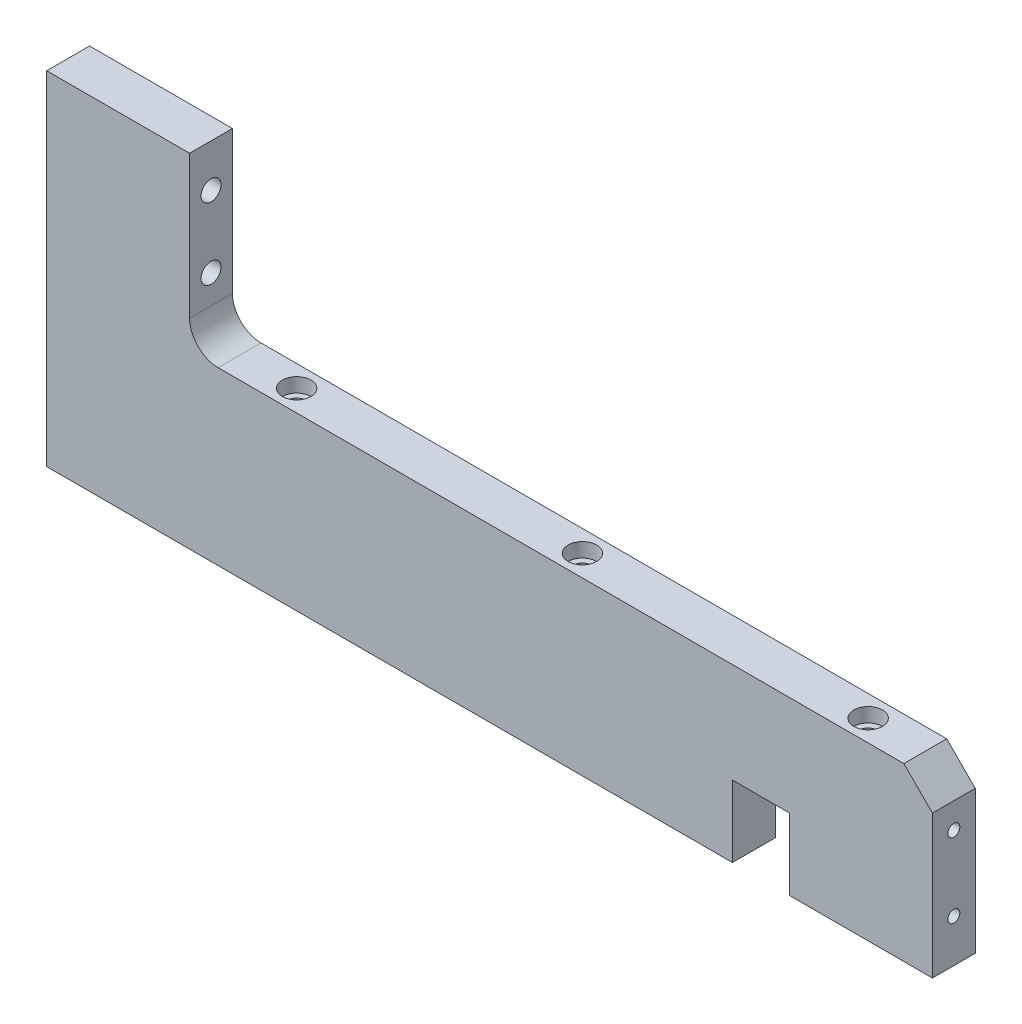
ISO-10303-21;
HEADER;
FILE_DESCRIPTION(('STEP AP214'),'2;1');
FILE_NAME('part.step','',(''),(''),'','','');
FILE_SCHEMA(('AUTOMOTIVE_DESIGN { 1 0 10303 214 1 1 1 1 }'));
ENDSEC;
DATA;
#1=APPLICATION_CONTEXT('core data for automotive mechanical design processes');
#2=APPLICATION_PROTOCOL_DEFINITION('international standard','automotive_design',2000,#1);
#3=PRODUCT_CONTEXT('',#1,'mechanical');
#4=PRODUCT('Part','Part','',(#3));
#5=PRODUCT_RELATED_PRODUCT_CATEGORY('part','',(#4));
#6=PRODUCT_DEFINITION_FORMATION('','',#4);
#7=PRODUCT_DEFINITION_CONTEXT('part definition',#1,'design');
#8=PRODUCT_DEFINITION('design','',#6,#7);
#9=PRODUCT_DEFINITION_SHAPE('','',#8);
#10=(LENGTH_UNIT() NAMED_UNIT(*) SI_UNIT(.MILLI.,.METRE.));
#11=(NAMED_UNIT(*) PLANE_ANGLE_UNIT() SI_UNIT($,.RADIAN.));
#12=(NAMED_UNIT(*) SI_UNIT($,.STERADIAN.) SOLID_ANGLE_UNIT());
#13=UNCERTAINTY_MEASURE_WITH_UNIT(LENGTH_MEASURE(1.E-05),#10,'distance_accuracy_value','');
#14=(GEOMETRIC_REPRESENTATION_CONTEXT(3) GLOBAL_UNCERTAINTY_ASSIGNED_CONTEXT((#13)) GLOBAL_UNIT_ASSIGNED_CONTEXT((#10,
#11,#12)) REPRESENTATION_CONTEXT('',''));
#15=CARTESIAN_POINT('',(0.,0.,0.));
#16=DIRECTION('',(0.,0.,1.));
#17=DIRECTION('',(1.,0.,0.));
#18=AXIS2_PLACEMENT_3D('',#15,#16,#17);
#19=CARTESIAN_POINT('',(0.,0.,15.));
#20=DIRECTION('',(0.,1.,0.));
#21=DIRECTION('',(0.,0.,1.));
#22=AXIS2_PLACEMENT_3D('',#19,#20,#21);
#23=PLANE('',#22);
#24=CARTESIAN_POINT('',(280.,0.,7.50000000000003));
#25=DIRECTION('',(0.,1.,0.));
#26=DIRECTION('',(0.,0.,1.));
#27=AXIS2_PLACEMENT_3D('',#24,#25,#26);
#28=CIRCLE('',#27,2.90000000000001);
#29=CARTESIAN_POINT('',(280.,0.,10.4));
#30=VERTEX_POINT('',#29);
#31=EDGE_CURVE('E212',#30,#30,#28,.T.);
#32=ORIENTED_EDGE('',*,*,#31,.T.);
#33=EDGE_LOOP('',(#32));
#34=FACE_BOUND('',#33,.T.);
#35=DIRECTION('',(1.,0.,0.));
#36=VECTOR('',#35,1.);
#37=CARTESIAN_POINT('',(0.,0.,15.));
#38=LINE('',#37,#36);
#39=CARTESIAN_POINT('',(260.,0.,15.));
#40=VERTEX_POINT('',#39);
#41=CARTESIAN_POINT('',(310.,0.,15.));
#42=VERTEX_POINT('',#41);
#43=EDGE_CURVE('E241',#40,#42,#38,.T.);
#44=ORIENTED_EDGE('',*,*,#43,.F.);
#45=DIRECTION('',(0.,0.,1.));
#46=VECTOR('',#45,1.);
#47=CARTESIAN_POINT('',(260.,0.,0.));
#48=LINE('',#47,#46);
#49=CARTESIAN_POINT('',(260.,0.,0.));
#50=VERTEX_POINT('',#49);
#51=EDGE_CURVE('E161',#50,#40,#48,.T.);
#52=ORIENTED_EDGE('',*,*,#51,.F.);
#53=DIRECTION('',(1.,0.,0.));
#54=VECTOR('',#53,1.);
#55=CARTESIAN_POINT('',(0.,0.,0.));
#56=LINE('',#55,#54);
#57=CARTESIAN_POINT('',(310.,0.,0.));
#58=VERTEX_POINT('',#57);
#59=EDGE_CURVE('E152',#50,#58,#56,.T.);
#60=ORIENTED_EDGE('',*,*,#59,.T.);
#61=DIRECTION('',(0.,0.,-1.));
#62=VECTOR('',#61,1.);
#63=CARTESIAN_POINT('',(310.,0.,15.));
#64=LINE('',#63,#62);
#65=EDGE_CURVE('E263',#42,#58,#64,.T.);
#66=ORIENTED_EDGE('',*,*,#65,.F.);
#67=EDGE_LOOP('',(#44,#52,#60,#66));
#68=FACE_BOUND('',#67,.T.);
#69=ADVANCED_FACE('F37',(#34,#68),#23,.F.);
#70=CARTESIAN_POINT('',(0.,0.,15.));
#71=DIRECTION('',(1.,0.,0.));
#72=DIRECTION('',(0.,0.,-1.));
#73=AXIS2_PLACEMENT_3D('',#70,#71,#72);
#74=PLANE('',#73);
#75=CARTESIAN_POINT('',(0.,105.,7.50000000000001));
#76=DIRECTION('',(1.,0.,0.));
#77=DIRECTION('',(0.,0.,-1.));
#78=AXIS2_PLACEMENT_3D('',#75,#76,#77);
#79=CIRCLE('',#78,3.5);
#80=CARTESIAN_POINT('',(0.,105.,4.));
#81=VERTEX_POINT('',#80);
#82=EDGE_CURVE('E180',#81,#81,#79,.T.);
#83=ORIENTED_EDGE('',*,*,#82,.T.);
#84=EDGE_LOOP('',(#83));
#85=FACE_BOUND('',#84,.T.);
#86=CARTESIAN_POINT('',(0.,80.,7.5));
#87=DIRECTION('',(1.,0.,0.));
#88=DIRECTION('',(0.,0.,-1.));
#89=AXIS2_PLACEMENT_3D('',#86,#87,#88);
#90=CIRCLE('',#89,3.5);
#91=CARTESIAN_POINT('',(0.,80.,4.));
#92=VERTEX_POINT('',#91);
#93=EDGE_CURVE('E186',#92,#92,#90,.T.);
#94=ORIENTED_EDGE('',*,*,#93,.T.);
#95=EDGE_LOOP('',(#94));
#96=FACE_BOUND('',#95,.T.);
#97=DIRECTION('',(0.,-1.,0.));
#98=VECTOR('',#97,1.);
#99=CARTESIAN_POINT('',(0.,0.,0.));
#100=LINE('',#99,#98);
#101=CARTESIAN_POINT('',(0.,120.,0.));
#102=VERTEX_POINT('',#101);
#103=CARTESIAN_POINT('',(0.,0.,0.));
#104=VERTEX_POINT('',#103);
#105=EDGE_CURVE('E237',#102,#104,#100,.T.);
#106=ORIENTED_EDGE('',*,*,#105,.T.);
#107=DIRECTION('',(0.,0.,-1.));
#108=VECTOR('',#107,1.);
#109=CARTESIAN_POINT('',(0.,0.,15.));
#110=LINE('',#109,#108);
#111=CARTESIAN_POINT('',(0.,0.,15.));
#112=VERTEX_POINT('',#111);
#113=EDGE_CURVE('E266',#112,#104,#110,.T.);
#114=ORIENTED_EDGE('',*,*,#113,.F.);
#115=DIRECTION('',(0.,-1.,0.));
#116=VECTOR('',#115,1.);
#117=CARTESIAN_POINT('',(0.,0.,15.));
#118=LINE('',#117,#116);
#119=CARTESIAN_POINT('',(0.,120.,15.));
#120=VERTEX_POINT('',#119);
#121=EDGE_CURVE('E238',#120,#112,#118,.T.);
#122=ORIENTED_EDGE('',*,*,#121,.F.);
#123=DIRECTION('',(0.,0.,-1.));
#124=VECTOR('',#123,1.);
#125=CARTESIAN_POINT('',(0.,120.,15.));
#126=LINE('',#125,#124);
#127=EDGE_CURVE('E251',#120,#102,#126,.T.);
#128=ORIENTED_EDGE('',*,*,#127,.T.);
#129=EDGE_LOOP('',(#106,#114,#122,#128));
#130=FACE_BOUND('',#129,.T.);
#131=ADVANCED_FACE('F315',(#85,#96,#130),#74,.F.);
#132=CARTESIAN_POINT('',(80.,0.,7.50000000000003));
#133=DIRECTION('',(0.,1.,0.));
#134=DIRECTION('',(0.,0.,1.));
#135=AXIS2_PLACEMENT_3D('',#132,#133,#134);
#136=CIRCLE('',#135,2.89999999999999);
#137=CARTESIAN_POINT('',(80.,0.,10.4));
#138=VERTEX_POINT('',#137);
#139=EDGE_CURVE('E200',#138,#138,#136,.T.);
#140=ORIENTED_EDGE('',*,*,#139,.T.);
#141=EDGE_LOOP('',(#140));
#142=FACE_BOUND('',#141,.T.);
#143=CARTESIAN_POINT('',(180.,0.,7.50000000000002));
#144=DIRECTION('',(0.,1.,0.));
#145=DIRECTION('',(0.,0.,1.));
#146=AXIS2_PLACEMENT_3D('',#143,#144,#145);
#147=CIRCLE('',#146,2.89999999999999);
#148=CARTESIAN_POINT('',(180.,0.,10.4));
#149=VERTEX_POINT('',#148);
#150=EDGE_CURVE('E224',#149,#149,#147,.T.);
#151=ORIENTED_EDGE('',*,*,#150,.T.);
#152=EDGE_LOOP('',(#151));
#153=FACE_BOUND('',#152,.T.);
#154=CARTESIAN_POINT('',(240.,0.,0.));
#155=VERTEX_POINT('',#154);
#156=EDGE_CURVE('E254',#104,#155,#56,.T.);
#157=ORIENTED_EDGE('',*,*,#156,.T.);
#158=DIRECTION('',(0.,0.,1.));
#159=VECTOR('',#158,1.);
#160=CARTESIAN_POINT('',(240.,0.,0.));
#161=LINE('',#160,#159);
#162=CARTESIAN_POINT('',(240.,0.,15.));
#163=VERTEX_POINT('',#162);
#164=EDGE_CURVE('E164',#155,#163,#161,.T.);
#165=ORIENTED_EDGE('',*,*,#164,.T.);
#166=EDGE_CURVE('E243',#112,#163,#38,.T.);
#167=ORIENTED_EDGE('',*,*,#166,.F.);
#168=ORIENTED_EDGE('',*,*,#113,.T.);
#169=EDGE_LOOP('',(#157,#165,#167,#168));
#170=FACE_BOUND('',#169,.T.);
#171=ADVANCED_FACE('F311',(#142,#153,#170),#23,.F.);
#172=CARTESIAN_POINT('',(310.,0.,15.));
#173=DIRECTION('',(-1.,0.,0.));
#174=DIRECTION('',(0.,0.,1.));
#175=AXIS2_PLACEMENT_3D('',#172,#173,#174);
#176=PLANE('',#175);
#177=CARTESIAN_POINT('',(310.,41.,7.5));
#178=DIRECTION('',(1.,0.,0.));
#179=DIRECTION('',(0.,0.,-1.));
#180=AXIS2_PLACEMENT_3D('',#177,#178,#179);
#181=CIRCLE('',#180,2.1);
#182=CARTESIAN_POINT('',(310.,41.,5.4));
#183=VERTEX_POINT('',#182);
#184=EDGE_CURVE('E163',#183,#183,#181,.T.);
#185=ORIENTED_EDGE('',*,*,#184,.F.);
#186=EDGE_LOOP('',(#185));
#187=FACE_BOUND('',#186,.T.);
#188=CARTESIAN_POINT('',(310.,15.,7.5));
#189=DIRECTION('',(1.,0.,0.));
#190=DIRECTION('',(0.,0.,-1.));
#191=AXIS2_PLACEMENT_3D('',#188,#189,#190);
#192=CIRCLE('',#191,2.1);
#193=CARTESIAN_POINT('',(310.,15.,5.4));
#194=VERTEX_POINT('',#193);
#195=EDGE_CURVE('E173',#194,#194,#192,.T.);
#196=ORIENTED_EDGE('',*,*,#195,.F.);
#197=EDGE_LOOP('',(#196));
#198=FACE_BOUND('',#197,.T.);
#199=DIRECTION('',(0.,1.,0.));
#200=VECTOR('',#199,1.);
#201=CARTESIAN_POINT('',(310.,0.,0.));
#202=LINE('',#201,#200);
#203=CARTESIAN_POINT('',(310.,50.,0.));
#204=VERTEX_POINT('',#203);
#205=EDGE_CURVE('E257',#58,#204,#202,.T.);
#206=ORIENTED_EDGE('',*,*,#205,.T.);
#207=DIRECTION('',(0.,0.,1.));
#208=VECTOR('',#207,1.);
#209=CARTESIAN_POINT('',(310.,50.,15.));
#210=LINE('',#209,#208);
#211=CARTESIAN_POINT('',(310.,50.,15.));
#212=VERTEX_POINT('',#211);
#213=EDGE_CURVE('E269',#204,#212,#210,.T.);
#214=ORIENTED_EDGE('',*,*,#213,.T.);
#215=DIRECTION('',(0.,1.,0.));
#216=VECTOR('',#215,1.);
#217=CARTESIAN_POINT('',(310.,0.,15.));
#218=LINE('',#217,#216);
#219=EDGE_CURVE('E246',#42,#212,#218,.T.);
#220=ORIENTED_EDGE('',*,*,#219,.F.);
#221=ORIENTED_EDGE('',*,*,#65,.T.);
#222=EDGE_LOOP('',(#206,#214,#220,#221));
#223=FACE_BOUND('',#222,.T.);
#224=ADVANCED_FACE('F303',(#187,#198,#223),#176,.F.);
#225=CARTESIAN_POINT('',(0.,120.,15.));
#226=DIRECTION('',(0.,-1.,0.));
#227=DIRECTION('',(0.,0.,-1.));
#228=AXIS2_PLACEMENT_3D('',#225,#226,#227);
#229=PLANE('',#228);
#230=DIRECTION('',(-1.,0.,0.));
#231=VECTOR('',#230,1.);
#232=CARTESIAN_POINT('',(0.,120.,15.));
#233=LINE('',#232,#231);
#234=CARTESIAN_POINT('',(50.,120.,15.));
#235=VERTEX_POINT('',#234);
#236=EDGE_CURVE('E249',#235,#120,#233,.T.);
#237=ORIENTED_EDGE('',*,*,#236,.F.);
#238=DIRECTION('',(0.,0.,1.));
#239=VECTOR('',#238,1.);
#240=CARTESIAN_POINT('',(50.,120.,0.));
#241=LINE('',#240,#239);
#242=CARTESIAN_POINT('',(50.,120.,0.));
#243=VERTEX_POINT('',#242);
#244=EDGE_CURVE('E233',#243,#235,#241,.T.);
#245=ORIENTED_EDGE('',*,*,#244,.F.);
#246=DIRECTION('',(-1.,0.,0.));
#247=VECTOR('',#246,1.);
#248=CARTESIAN_POINT('',(0.,120.,0.));
#249=LINE('',#248,#247);
#250=EDGE_CURVE('E242',#243,#102,#249,.T.);
#251=ORIENTED_EDGE('',*,*,#250,.T.);
#252=ORIENTED_EDGE('',*,*,#127,.F.);
#253=EDGE_LOOP('',(#237,#245,#251,#252));
#254=FACE_BOUND('',#253,.T.);
#255=ADVANCED_FACE('F319',(#254),#229,.F.);
#256=CARTESIAN_POINT('',(0.,120.,15.));
#257=DIRECTION('',(0.,0.,-1.));
#258=DIRECTION('',(-1.,0.,0.));
#259=AXIS2_PLACEMENT_3D('',#256,#257,#258);
#260=PLANE('',#259);
#261=DIRECTION('',(-1.,0.,0.));
#262=VECTOR('',#261,1.);
#263=CARTESIAN_POINT('',(260.,25.,15.));
#264=LINE('',#263,#262);
#265=CARTESIAN_POINT('',(260.,25.,15.));
#266=VERTEX_POINT('',#265);
#267=CARTESIAN_POINT('',(240.,25.,15.));
#268=VERTEX_POINT('',#267);
#269=EDGE_CURVE('E155',#266,#268,#264,.T.);
#270=ORIENTED_EDGE('',*,*,#269,.F.);
#271=DIRECTION('',(0.,1.,0.));
#272=VECTOR('',#271,1.);
#273=CARTESIAN_POINT('',(260.,25.,15.));
#274=LINE('',#273,#272);
#275=EDGE_CURVE('E138',#40,#266,#274,.T.);
#276=ORIENTED_EDGE('',*,*,#275,.F.);
#277=ORIENTED_EDGE('',*,*,#43,.T.);
#278=ORIENTED_EDGE('',*,*,#219,.T.);
#279=DIRECTION('',(0.707106781186549,-0.707106781186547,0.));
#280=VECTOR('',#279,1.);
#281=CARTESIAN_POINT('',(310.,50.,15.));
#282=LINE('',#281,#280);
#283=CARTESIAN_POINT('',(300.,60.,15.));
#284=VERTEX_POINT('',#283);
#285=EDGE_CURVE('E272',#212,#284,#282,.F.);
#286=ORIENTED_EDGE('',*,*,#285,.T.);
#287=DIRECTION('',(1.,0.,0.));
#288=VECTOR('',#287,1.);
#289=CARTESIAN_POINT('',(310.,60.,15.));
#290=LINE('',#289,#288);
#291=CARTESIAN_POINT('',(60.,60.,15.));
#292=VERTEX_POINT('',#291);
#293=EDGE_CURVE('E231',#292,#284,#290,.T.);
#294=ORIENTED_EDGE('',*,*,#293,.F.);
#295=CARTESIAN_POINT('',(60.,70.,15.));
#296=DIRECTION('',(0.,0.,-1.));
#297=DIRECTION('',(-1.,0.,0.));
#298=AXIS2_PLACEMENT_3D('',#295,#296,#297);
#299=CIRCLE('',#298,10.);
#300=CARTESIAN_POINT('',(50.,70.,15.));
#301=VERTEX_POINT('',#300);
#302=EDGE_CURVE('E45',#292,#301,#299,.T.);
#303=ORIENTED_EDGE('',*,*,#302,.T.);
#304=DIRECTION('',(0.,-1.,0.));
#305=VECTOR('',#304,1.);
#306=CARTESIAN_POINT('',(50.,120.,15.));
#307=LINE('',#306,#305);
#308=EDGE_CURVE('E227',#235,#301,#307,.T.);
#309=ORIENTED_EDGE('',*,*,#308,.F.);
#310=ORIENTED_EDGE('',*,*,#236,.T.);
#311=ORIENTED_EDGE('',*,*,#121,.T.);
#312=ORIENTED_EDGE('',*,*,#166,.T.);
#313=DIRECTION('',(0.,-1.,0.));
#314=VECTOR('',#313,1.);
#315=CARTESIAN_POINT('',(240.,25.,15.));
#316=LINE('',#315,#314);
#317=EDGE_CURVE('E153',#268,#163,#316,.T.);
#318=ORIENTED_EDGE('',*,*,#317,.F.);
#319=EDGE_LOOP('',(#270,#276,#277,#278,#286,#294,#303,#309,#310,#311,#312,#318));
#320=FACE_BOUND('',#319,.T.);
#321=ADVANCED_FACE('F286',(#320),#260,.F.);
#322=CARTESIAN_POINT('',(0.,120.,0.));
#323=DIRECTION('',(0.,0.,-1.));
#324=DIRECTION('',(-1.,0.,0.));
#325=AXIS2_PLACEMENT_3D('',#322,#323,#324);
#326=PLANE('',#325);
#327=DIRECTION('',(0.,1.,0.));
#328=VECTOR('',#327,1.);
#329=CARTESIAN_POINT('',(260.,25.,0.));
#330=LINE('',#329,#328);
#331=CARTESIAN_POINT('',(260.,25.,0.));
#332=VERTEX_POINT('',#331);
#333=EDGE_CURVE('E135',#50,#332,#330,.T.);
#334=ORIENTED_EDGE('',*,*,#333,.T.);
#335=DIRECTION('',(-1.,0.,0.));
#336=VECTOR('',#335,1.);
#337=CARTESIAN_POINT('',(260.,25.,0.));
#338=LINE('',#337,#336);
#339=CARTESIAN_POINT('',(240.,25.,0.));
#340=VERTEX_POINT('',#339);
#341=EDGE_CURVE('E145',#332,#340,#338,.T.);
#342=ORIENTED_EDGE('',*,*,#341,.T.);
#343=DIRECTION('',(0.,-1.,0.));
#344=VECTOR('',#343,1.);
#345=CARTESIAN_POINT('',(240.,25.,0.));
#346=LINE('',#345,#344);
#347=EDGE_CURVE('E52',#340,#155,#346,.T.);
#348=ORIENTED_EDGE('',*,*,#347,.T.);
#349=ORIENTED_EDGE('',*,*,#156,.F.);
#350=ORIENTED_EDGE('',*,*,#105,.F.);
#351=ORIENTED_EDGE('',*,*,#250,.F.);
#352=DIRECTION('',(0.,-1.,0.));
#353=VECTOR('',#352,1.);
#354=CARTESIAN_POINT('',(50.,120.,0.));
#355=LINE('',#354,#353);
#356=CARTESIAN_POINT('',(50.,70.,0.));
#357=VERTEX_POINT('',#356);
#358=EDGE_CURVE('E228',#243,#357,#355,.T.);
#359=ORIENTED_EDGE('',*,*,#358,.T.);
#360=CARTESIAN_POINT('',(60.,70.,0.));
#361=DIRECTION('',(0.,0.,-1.));
#362=DIRECTION('',(-1.,0.,0.));
#363=AXIS2_PLACEMENT_3D('',#360,#361,#362);
#364=CIRCLE('',#363,10.);
#365=CARTESIAN_POINT('',(60.,60.,0.));
#366=VERTEX_POINT('',#365);
#367=EDGE_CURVE('E11',#357,#366,#364,.F.);
#368=ORIENTED_EDGE('',*,*,#367,.T.);
#369=DIRECTION('',(1.,0.,0.));
#370=VECTOR('',#369,1.);
#371=CARTESIAN_POINT('',(310.,60.,0.));
#372=LINE('',#371,#370);
#373=CARTESIAN_POINT('',(300.,60.,0.));
#374=VERTEX_POINT('',#373);
#375=EDGE_CURVE('E230',#366,#374,#372,.T.);
#376=ORIENTED_EDGE('',*,*,#375,.T.);
#377=DIRECTION('',(-0.707106781186549,0.707106781186547,0.));
#378=VECTOR('',#377,1.);
#379=CARTESIAN_POINT('',(120.,240.,0.));
#380=LINE('',#379,#378);
#381=EDGE_CURVE('E278',#374,#204,#380,.F.);
#382=ORIENTED_EDGE('',*,*,#381,.T.);
#383=ORIENTED_EDGE('',*,*,#205,.F.);
#384=ORIENTED_EDGE('',*,*,#59,.F.);
#385=EDGE_LOOP('',(#334,#342,#348,#349,#350,#351,#359,#368,#376,#382,#383,#384));
#386=FACE_BOUND('',#385,.T.);
#387=ADVANCED_FACE('F150',(#386),#326,.T.);
#388=CARTESIAN_POINT('',(310.,60.,0.));
#389=DIRECTION('',(0.,-1.,0.));
#390=DIRECTION('',(1.,0.,0.));
#391=AXIS2_PLACEMENT_3D('',#388,#389,#390);
#392=PLANE('',#391);
#393=CARTESIAN_POINT('',(80.,60.,7.50000000000003));
#394=DIRECTION('',(0.,1.,0.));
#395=DIRECTION('',(0.,0.,1.));
#396=AXIS2_PLACEMENT_3D('',#393,#394,#395);
#397=CIRCLE('',#396,5.);
#398=CARTESIAN_POINT('',(80.,60.,12.5));
#399=VERTEX_POINT('',#398);
#400=EDGE_CURVE('E189',#399,#399,#397,.T.);
#401=ORIENTED_EDGE('',*,*,#400,.F.);
#402=EDGE_LOOP('',(#401));
#403=FACE_BOUND('',#402,.T.);
#404=CARTESIAN_POINT('',(280.,60.,7.50000000000003));
#405=DIRECTION('',(0.,1.,0.));
#406=DIRECTION('',(0.,0.,1.));
#407=AXIS2_PLACEMENT_3D('',#404,#405,#406);
#408=CIRCLE('',#407,5.);
#409=CARTESIAN_POINT('',(280.,60.,12.5));
#410=VERTEX_POINT('',#409);
#411=EDGE_CURVE('E203',#410,#410,#408,.T.);
#412=ORIENTED_EDGE('',*,*,#411,.F.);
#413=EDGE_LOOP('',(#412));
#414=FACE_BOUND('',#413,.T.);
#415=CARTESIAN_POINT('',(180.,60.,7.50000000000002));
#416=DIRECTION('',(0.,1.,0.));
#417=DIRECTION('',(0.,0.,1.));
#418=AXIS2_PLACEMENT_3D('',#415,#416,#417);
#419=CIRCLE('',#418,5.);
#420=CARTESIAN_POINT('',(180.,60.,12.5));
#421=VERTEX_POINT('',#420);
#422=EDGE_CURVE('E215',#421,#421,#419,.T.);
#423=ORIENTED_EDGE('',*,*,#422,.F.);
#424=EDGE_LOOP('',(#423));
#425=FACE_BOUND('',#424,.T.);
#426=ORIENTED_EDGE('',*,*,#375,.F.);
#427=DIRECTION('',(0.,0.,1.));
#428=VECTOR('',#427,1.);
#429=CARTESIAN_POINT('',(60.,60.,15.));
#430=LINE('',#429,#428);
#431=EDGE_CURVE('E280',#366,#292,#430,.T.);
#432=ORIENTED_EDGE('',*,*,#431,.T.);
#433=ORIENTED_EDGE('',*,*,#293,.T.);
#434=DIRECTION('',(0.,0.,-1.));
#435=VECTOR('',#434,1.);
#436=CARTESIAN_POINT('',(300.,60.,0.));
#437=LINE('',#436,#435);
#438=EDGE_CURVE('E275',#284,#374,#437,.T.);
#439=ORIENTED_EDGE('',*,*,#438,.T.);
#440=EDGE_LOOP('',(#426,#432,#433,#439));
#441=FACE_BOUND('',#440,.T.);
#442=ADVANCED_FACE('F296',(#403,#414,#425,#441),#392,.F.);
#443=CARTESIAN_POINT('',(50.,120.,0.));
#444=DIRECTION('',(-1.,0.,0.));
#445=DIRECTION('',(0.,-1.,0.));
#446=AXIS2_PLACEMENT_3D('',#443,#444,#445);
#447=PLANE('',#446);
#448=CARTESIAN_POINT('',(50.,105.,7.50000000000001));
#449=DIRECTION('',(1.,0.,0.));
#450=DIRECTION('',(0.,0.,-1.));
#451=AXIS2_PLACEMENT_3D('',#448,#449,#450);
#452=CIRCLE('',#451,3.5);
#453=CARTESIAN_POINT('',(50.,105.,4.));
#454=VERTEX_POINT('',#453);
#455=EDGE_CURVE('E179',#454,#454,#452,.T.);
#456=ORIENTED_EDGE('',*,*,#455,.F.);
#457=EDGE_LOOP('',(#456));
#458=FACE_BOUND('',#457,.T.);
#459=CARTESIAN_POINT('',(50.,80.,7.5));
#460=DIRECTION('',(1.,0.,0.));
#461=DIRECTION('',(0.,0.,-1.));
#462=AXIS2_PLACEMENT_3D('',#459,#460,#461);
#463=CIRCLE('',#462,3.5);
#464=CARTESIAN_POINT('',(50.,80.,4.));
#465=VERTEX_POINT('',#464);
#466=EDGE_CURVE('E183',#465,#465,#463,.T.);
#467=ORIENTED_EDGE('',*,*,#466,.F.);
#468=EDGE_LOOP('',(#467));
#469=FACE_BOUND('',#468,.T.);
#470=ORIENTED_EDGE('',*,*,#308,.T.);
#471=DIRECTION('',(0.,0.,1.));
#472=VECTOR('',#471,1.);
#473=CARTESIAN_POINT('',(50.,70.,0.));
#474=LINE('',#473,#472);
#475=EDGE_CURVE('E60',#301,#357,#474,.F.);
#476=ORIENTED_EDGE('',*,*,#475,.T.);
#477=ORIENTED_EDGE('',*,*,#358,.F.);
#478=ORIENTED_EDGE('',*,*,#244,.T.);
#479=EDGE_LOOP('',(#470,#476,#477,#478));
#480=FACE_BOUND('',#479,.T.);
#481=ADVANCED_FACE('F290',(#458,#469,#480),#447,.F.);
#482=CARTESIAN_POINT('',(180.,60.,7.50000000000002));
#483=DIRECTION('',(0.,1.,0.));
#484=DIRECTION('',(0.,0.,1.));
#485=AXIS2_PLACEMENT_3D('',#482,#483,#484);
#486=CYLINDRICAL_SURFACE('',#485,2.9);
#487=ORIENTED_EDGE('',*,*,#150,.F.);
#488=EDGE_LOOP('',(#487));
#489=FACE_BOUND('',#488,.T.);
#490=CARTESIAN_POINT('',(180.,55.,7.50000000000002));
#491=DIRECTION('',(0.,1.,0.));
#492=DIRECTION('',(0.,0.,1.));
#493=AXIS2_PLACEMENT_3D('',#490,#491,#492);
#494=CIRCLE('',#493,2.90000000000001);
#495=CARTESIAN_POINT('',(180.,55.,10.4));
#496=VERTEX_POINT('',#495);
#497=EDGE_CURVE('E221',#496,#496,#494,.T.);
#498=ORIENTED_EDGE('',*,*,#497,.T.);
#499=EDGE_LOOP('',(#498));
#500=FACE_BOUND('',#499,.T.);
#501=ADVANCED_FACE('F349',(#489,#500),#486,.F.);
#502=CARTESIAN_POINT('',(182.9,55.,7.50000000000002));
#503=DIRECTION('',(0.,-1.,0.));
#504=DIRECTION('',(0.,0.,-1.));
#505=AXIS2_PLACEMENT_3D('',#502,#503,#504);
#506=PLANE('',#505);
#507=ORIENTED_EDGE('',*,*,#497,.F.);
#508=EDGE_LOOP('',(#507));
#509=FACE_BOUND('',#508,.T.);
#510=CARTESIAN_POINT('',(180.,55.,7.50000000000002));
#511=DIRECTION('',(0.,1.,0.));
#512=DIRECTION('',(0.,0.,1.));
#513=AXIS2_PLACEMENT_3D('',#510,#511,#512);
#514=CIRCLE('',#513,5.);
#515=CARTESIAN_POINT('',(180.,55.,12.5));
#516=VERTEX_POINT('',#515);
#517=EDGE_CURVE('E218',#516,#516,#514,.T.);
#518=ORIENTED_EDGE('',*,*,#517,.T.);
#519=EDGE_LOOP('',(#518));
#520=FACE_BOUND('',#519,.T.);
#521=ADVANCED_FACE('F352',(#509,#520),#506,.F.);
#522=CARTESIAN_POINT('',(180.,60.,7.50000000000002));
#523=DIRECTION('',(0.,1.,0.));
#524=DIRECTION('',(0.,0.,1.));
#525=AXIS2_PLACEMENT_3D('',#522,#523,#524);
#526=CYLINDRICAL_SURFACE('',#525,5.);
#527=ORIENTED_EDGE('',*,*,#517,.F.);
#528=EDGE_LOOP('',(#527));
#529=FACE_BOUND('',#528,.T.);
#530=ORIENTED_EDGE('',*,*,#422,.T.);
#531=EDGE_LOOP('',(#530));
#532=FACE_BOUND('',#531,.T.);
#533=ADVANCED_FACE('F358',(#529,#532),#526,.F.);
#534=CARTESIAN_POINT('',(280.,60.,7.50000000000003));
#535=DIRECTION('',(0.,1.,0.));
#536=DIRECTION('',(0.,0.,1.));
#537=AXIS2_PLACEMENT_3D('',#534,#535,#536);
#538=CYLINDRICAL_SURFACE('',#537,2.90000000000001);
#539=ORIENTED_EDGE('',*,*,#31,.F.);
#540=EDGE_LOOP('',(#539));
#541=FACE_BOUND('',#540,.T.);
#542=CARTESIAN_POINT('',(280.,55.,7.50000000000003));
#543=DIRECTION('',(0.,1.,0.));
#544=DIRECTION('',(0.,0.,1.));
#545=AXIS2_PLACEMENT_3D('',#542,#543,#544);
#546=CIRCLE('',#545,2.90000000000001);
#547=CARTESIAN_POINT('',(280.,55.,10.4));
#548=VERTEX_POINT('',#547);
#549=EDGE_CURVE('E209',#548,#548,#546,.T.);
#550=ORIENTED_EDGE('',*,*,#549,.T.);
#551=EDGE_LOOP('',(#550));
#552=FACE_BOUND('',#551,.T.);
#553=ADVANCED_FACE('F364',(#541,#552),#538,.F.);
#554=CARTESIAN_POINT('',(282.9,55.,7.50000000000003));
#555=DIRECTION('',(0.,-1.,0.));
#556=DIRECTION('',(0.,0.,-1.));
#557=AXIS2_PLACEMENT_3D('',#554,#555,#556);
#558=PLANE('',#557);
#559=ORIENTED_EDGE('',*,*,#549,.F.);
#560=EDGE_LOOP('',(#559));
#561=FACE_BOUND('',#560,.T.);
#562=CARTESIAN_POINT('',(280.,55.,7.50000000000003));
#563=DIRECTION('',(0.,1.,0.));
#564=DIRECTION('',(0.,0.,1.));
#565=AXIS2_PLACEMENT_3D('',#562,#563,#564);
#566=CIRCLE('',#565,5.);
#567=CARTESIAN_POINT('',(280.,55.,12.5));
#568=VERTEX_POINT('',#567);
#569=EDGE_CURVE('E206',#568,#568,#566,.T.);
#570=ORIENTED_EDGE('',*,*,#569,.T.);
#571=EDGE_LOOP('',(#570));
#572=FACE_BOUND('',#571,.T.);
#573=ADVANCED_FACE('F383',(#561,#572),#558,.F.);
#574=CARTESIAN_POINT('',(280.,60.,7.50000000000003));
#575=DIRECTION('',(0.,1.,0.));
#576=DIRECTION('',(0.,0.,1.));
#577=AXIS2_PLACEMENT_3D('',#574,#575,#576);
#578=CYLINDRICAL_SURFACE('',#577,5.);
#579=ORIENTED_EDGE('',*,*,#569,.F.);
#580=EDGE_LOOP('',(#579));
#581=FACE_BOUND('',#580,.T.);
#582=ORIENTED_EDGE('',*,*,#411,.T.);
#583=EDGE_LOOP('',(#582));
#584=FACE_BOUND('',#583,.T.);
#585=ADVANCED_FACE('F387',(#581,#584),#578,.F.);
#586=CARTESIAN_POINT('',(80.,60.,7.50000000000003));
#587=DIRECTION('',(0.,1.,0.));
#588=DIRECTION('',(0.,0.,1.));
#589=AXIS2_PLACEMENT_3D('',#586,#587,#588);
#590=CYLINDRICAL_SURFACE('',#589,2.89999999999999);
#591=ORIENTED_EDGE('',*,*,#139,.F.);
#592=EDGE_LOOP('',(#591));
#593=FACE_BOUND('',#592,.T.);
#594=CARTESIAN_POINT('',(80.,55.,7.50000000000003));
#595=DIRECTION('',(0.,1.,0.));
#596=DIRECTION('',(0.,0.,1.));
#597=AXIS2_PLACEMENT_3D('',#594,#595,#596);
#598=CIRCLE('',#597,2.9);
#599=CARTESIAN_POINT('',(80.,55.,10.4));
#600=VERTEX_POINT('',#599);
#601=EDGE_CURVE('E197',#600,#600,#598,.T.);
#602=ORIENTED_EDGE('',*,*,#601,.T.);
#603=EDGE_LOOP('',(#602));
#604=FACE_BOUND('',#603,.T.);
#605=ADVANCED_FACE('F391',(#593,#604),#590,.F.);
#606=CARTESIAN_POINT('',(82.9,55.,7.50000000000003));
#607=DIRECTION('',(0.,-1.,0.));
#608=DIRECTION('',(0.,0.,-1.));
#609=AXIS2_PLACEMENT_3D('',#606,#607,#608);
#610=PLANE('',#609);
#611=ORIENTED_EDGE('',*,*,#601,.F.);
#612=EDGE_LOOP('',(#611));
#613=FACE_BOUND('',#612,.T.);
#614=CARTESIAN_POINT('',(80.,55.,7.50000000000003));
#615=DIRECTION('',(0.,1.,0.));
#616=DIRECTION('',(0.,0.,1.));
#617=AXIS2_PLACEMENT_3D('',#614,#615,#616);
#618=CIRCLE('',#617,5.);
#619=CARTESIAN_POINT('',(80.,55.,12.5));
#620=VERTEX_POINT('',#619);
#621=EDGE_CURVE('E194',#620,#620,#618,.T.);
#622=ORIENTED_EDGE('',*,*,#621,.T.);
#623=EDGE_LOOP('',(#622));
#624=FACE_BOUND('',#623,.T.);
#625=ADVANCED_FACE('F395',(#613,#624),#610,.F.);
#626=CARTESIAN_POINT('',(80.,60.,7.50000000000003));
#627=DIRECTION('',(0.,1.,0.));
#628=DIRECTION('',(0.,0.,1.));
#629=AXIS2_PLACEMENT_3D('',#626,#627,#628);
#630=CYLINDRICAL_SURFACE('',#629,5.);
#631=ORIENTED_EDGE('',*,*,#621,.F.);
#632=EDGE_LOOP('',(#631));
#633=FACE_BOUND('',#632,.T.);
#634=ORIENTED_EDGE('',*,*,#400,.T.);
#635=EDGE_LOOP('',(#634));
#636=FACE_BOUND('',#635,.T.);
#637=ADVANCED_FACE('F399',(#633,#636),#630,.F.);
#638=CARTESIAN_POINT('',(0.,80.,7.5));
#639=DIRECTION('',(1.,0.,0.));
#640=DIRECTION('',(0.,0.,-1.));
#641=AXIS2_PLACEMENT_3D('',#638,#639,#640);
#642=CYLINDRICAL_SURFACE('',#641,3.5);
#643=ORIENTED_EDGE('',*,*,#93,.F.);
#644=EDGE_LOOP('',(#643));
#645=FACE_BOUND('',#644,.T.);
#646=ORIENTED_EDGE('',*,*,#466,.T.);
#647=EDGE_LOOP('',(#646));
#648=FACE_BOUND('',#647,.T.);
#649=ADVANCED_FACE('F403',(#645,#648),#642,.F.);
#650=CARTESIAN_POINT('',(0.,105.,7.50000000000001));
#651=DIRECTION('',(1.,0.,0.));
#652=DIRECTION('',(0.,0.,-1.));
#653=AXIS2_PLACEMENT_3D('',#650,#651,#652);
#654=CYLINDRICAL_SURFACE('',#653,3.5);
#655=ORIENTED_EDGE('',*,*,#82,.F.);
#656=EDGE_LOOP('',(#655));
#657=FACE_BOUND('',#656,.T.);
#658=ORIENTED_EDGE('',*,*,#455,.T.);
#659=EDGE_LOOP('',(#658));
#660=FACE_BOUND('',#659,.T.);
#661=ADVANCED_FACE('F407',(#657,#660),#654,.F.);
#662=CARTESIAN_POINT('',(310.,50.,15.));
#663=DIRECTION('',(-0.707106781186546,-0.707106781186548,0.));
#664=DIRECTION('',(0.707106781186549,-0.707106781186547,0.));
#665=AXIS2_PLACEMENT_3D('',#662,#663,#664);
#666=PLANE('',#665);
#667=ORIENTED_EDGE('',*,*,#381,.F.);
#668=ORIENTED_EDGE('',*,*,#438,.F.);
#669=ORIENTED_EDGE('',*,*,#285,.F.);
#670=ORIENTED_EDGE('',*,*,#213,.F.);
#671=EDGE_LOOP('',(#667,#668,#669,#670));
#672=FACE_BOUND('',#671,.T.);
#673=ADVANCED_FACE('F301',(#672),#666,.F.);
#674=CARTESIAN_POINT('',(60.,70.,0.));
#675=DIRECTION('',(0.,0.,-1.));
#676=DIRECTION('',(-1.,0.,0.));
#677=AXIS2_PLACEMENT_3D('',#674,#675,#676);
#678=CYLINDRICAL_SURFACE('',#677,10.);
#679=ORIENTED_EDGE('',*,*,#367,.F.);
#680=ORIENTED_EDGE('',*,*,#475,.F.);
#681=ORIENTED_EDGE('',*,*,#302,.F.);
#682=ORIENTED_EDGE('',*,*,#431,.F.);
#683=EDGE_LOOP('',(#679,#680,#681,#682));
#684=FACE_BOUND('',#683,.T.);
#685=ADVANCED_FACE('F39',(#684),#678,.F.);
#686=CARTESIAN_POINT('',(297.6,15.,7.5));
#687=DIRECTION('',(1.,0.,0.));
#688=DIRECTION('',(0.,0.,-1.));
#689=AXIS2_PLACEMENT_3D('',#686,#687,#688);
#690=CONICAL_SURFACE('',#689,2.1,1.02974425867667);
#691=CARTESIAN_POINT('',(296.338192700042,15.,7.5));
#692=VERTEX_POINT('',#691);
#693=VERTEX_LOOP('',#692);
#694=FACE_BOUND('',#693,.T.);
#695=CARTESIAN_POINT('',(297.6,15.,7.5));
#696=DIRECTION('',(1.,0.,0.));
#697=DIRECTION('',(0.,0.,-1.));
#698=AXIS2_PLACEMENT_3D('',#695,#696,#697);
#699=CIRCLE('',#698,2.1);
#700=CARTESIAN_POINT('',(297.6,15.,5.4));
#701=VERTEX_POINT('',#700);
#702=EDGE_CURVE('E176',#701,#701,#699,.T.);
#703=ORIENTED_EDGE('',*,*,#702,.T.);
#704=EDGE_LOOP('',(#703));
#705=FACE_BOUND('',#704,.T.);
#706=ADVANCED_FACE('F412',(#694,#705),#690,.F.);
#707=CARTESIAN_POINT('',(310.,15.,7.5));
#708=DIRECTION('',(1.,0.,0.));
#709=DIRECTION('',(0.,0.,-1.));
#710=AXIS2_PLACEMENT_3D('',#707,#708,#709);
#711=CYLINDRICAL_SURFACE('',#710,2.1);
#712=ORIENTED_EDGE('',*,*,#702,.F.);
#713=EDGE_LOOP('',(#712));
#714=FACE_BOUND('',#713,.T.);
#715=ORIENTED_EDGE('',*,*,#195,.T.);
#716=EDGE_LOOP('',(#715));
#717=FACE_BOUND('',#716,.T.);
#718=ADVANCED_FACE('F415',(#714,#717),#711,.F.);
#719=CARTESIAN_POINT('',(297.6,41.,7.5));
#720=DIRECTION('',(1.,0.,0.));
#721=DIRECTION('',(0.,0.,-1.));
#722=AXIS2_PLACEMENT_3D('',#719,#720,#721);
#723=CONICAL_SURFACE('',#722,2.1,1.02974425867667);
#724=CARTESIAN_POINT('',(296.338192700042,41.,7.5));
#725=VERTEX_POINT('',#724);
#726=VERTEX_LOOP('',#725);
#727=FACE_BOUND('',#726,.T.);
#728=CARTESIAN_POINT('',(297.6,41.,7.5));
#729=DIRECTION('',(1.,0.,0.));
#730=DIRECTION('',(0.,0.,-1.));
#731=AXIS2_PLACEMENT_3D('',#728,#729,#730);
#732=CIRCLE('',#731,2.1);
#733=CARTESIAN_POINT('',(297.6,41.,5.4));
#734=VERTEX_POINT('',#733);
#735=EDGE_CURVE('E170',#734,#734,#732,.T.);
#736=ORIENTED_EDGE('',*,*,#735,.T.);
#737=EDGE_LOOP('',(#736));
#738=FACE_BOUND('',#737,.T.);
#739=ADVANCED_FACE('F419',(#727,#738),#723,.F.);
#740=CARTESIAN_POINT('',(310.,41.,7.5));
#741=DIRECTION('',(1.,0.,0.));
#742=DIRECTION('',(0.,0.,-1.));
#743=AXIS2_PLACEMENT_3D('',#740,#741,#742);
#744=CYLINDRICAL_SURFACE('',#743,2.1);
#745=ORIENTED_EDGE('',*,*,#735,.F.);
#746=EDGE_LOOP('',(#745));
#747=FACE_BOUND('',#746,.T.);
#748=ORIENTED_EDGE('',*,*,#184,.T.);
#749=EDGE_LOOP('',(#748));
#750=FACE_BOUND('',#749,.T.);
#751=ADVANCED_FACE('F423',(#747,#750),#744,.F.);
#752=CARTESIAN_POINT('',(260.,25.,0.));
#753=DIRECTION('',(1.,0.,0.));
#754=DIRECTION('',(0.,0.,-1.));
#755=AXIS2_PLACEMENT_3D('',#752,#753,#754);
#756=PLANE('',#755);
#757=ORIENTED_EDGE('',*,*,#275,.T.);
#758=DIRECTION('',(0.,0.,1.));
#759=VECTOR('',#758,1.);
#760=CARTESIAN_POINT('',(260.,25.,0.));
#761=LINE('',#760,#759);
#762=EDGE_CURVE('E131',#332,#266,#761,.T.);
#763=ORIENTED_EDGE('',*,*,#762,.F.);
#764=ORIENTED_EDGE('',*,*,#333,.F.);
#765=ORIENTED_EDGE('',*,*,#51,.T.);
#766=EDGE_LOOP('',(#757,#763,#764,#765));
#767=FACE_BOUND('',#766,.T.);
#768=ADVANCED_FACE('F133',(#767),#756,.F.);
#769=CARTESIAN_POINT('',(240.,25.,0.));
#770=DIRECTION('',(-1.,0.,0.));
#771=DIRECTION('',(0.,0.,1.));
#772=AXIS2_PLACEMENT_3D('',#769,#770,#771);
#773=PLANE('',#772);
#774=ORIENTED_EDGE('',*,*,#317,.T.);
#775=ORIENTED_EDGE('',*,*,#164,.F.);
#776=ORIENTED_EDGE('',*,*,#347,.F.);
#777=DIRECTION('',(0.,0.,1.));
#778=VECTOR('',#777,1.);
#779=CARTESIAN_POINT('',(240.,25.,0.));
#780=LINE('',#779,#778);
#781=EDGE_CURVE('E142',#340,#268,#780,.T.);
#782=ORIENTED_EDGE('',*,*,#781,.T.);
#783=EDGE_LOOP('',(#774,#775,#776,#782));
#784=FACE_BOUND('',#783,.T.);
#785=ADVANCED_FACE('F309',(#784),#773,.F.);
#786=CARTESIAN_POINT('',(260.,25.,0.));
#787=DIRECTION('',(0.,1.,0.));
#788=DIRECTION('',(-1.,0.,0.));
#789=AXIS2_PLACEMENT_3D('',#786,#787,#788);
#790=PLANE('',#789);
#791=ORIENTED_EDGE('',*,*,#269,.T.);
#792=ORIENTED_EDGE('',*,*,#781,.F.);
#793=ORIENTED_EDGE('',*,*,#341,.F.);
#794=ORIENTED_EDGE('',*,*,#762,.T.);
#795=EDGE_LOOP('',(#791,#792,#793,#794));
#796=FACE_BOUND('',#795,.T.);
#797=ADVANCED_FACE('F146',(#796),#790,.F.);
#798=CLOSED_SHELL('',(#69,#131,#171,#224,#255,#321,#387,#442,#481,#501,#521,#533,#553,#573,#585,
#605,#625,#637,#649,#661,#673,#685,#706,#718,#739,#751,#768,#785,#797));
#799=MANIFOLD_SOLID_BREP('B2',#798);
#800=ADVANCED_BREP_SHAPE_REPRESENTATION('',(#18,#799),#14);
#801=SHAPE_DEFINITION_REPRESENTATION(#9,#800);
ENDSEC;
END-ISO-10303-21;
